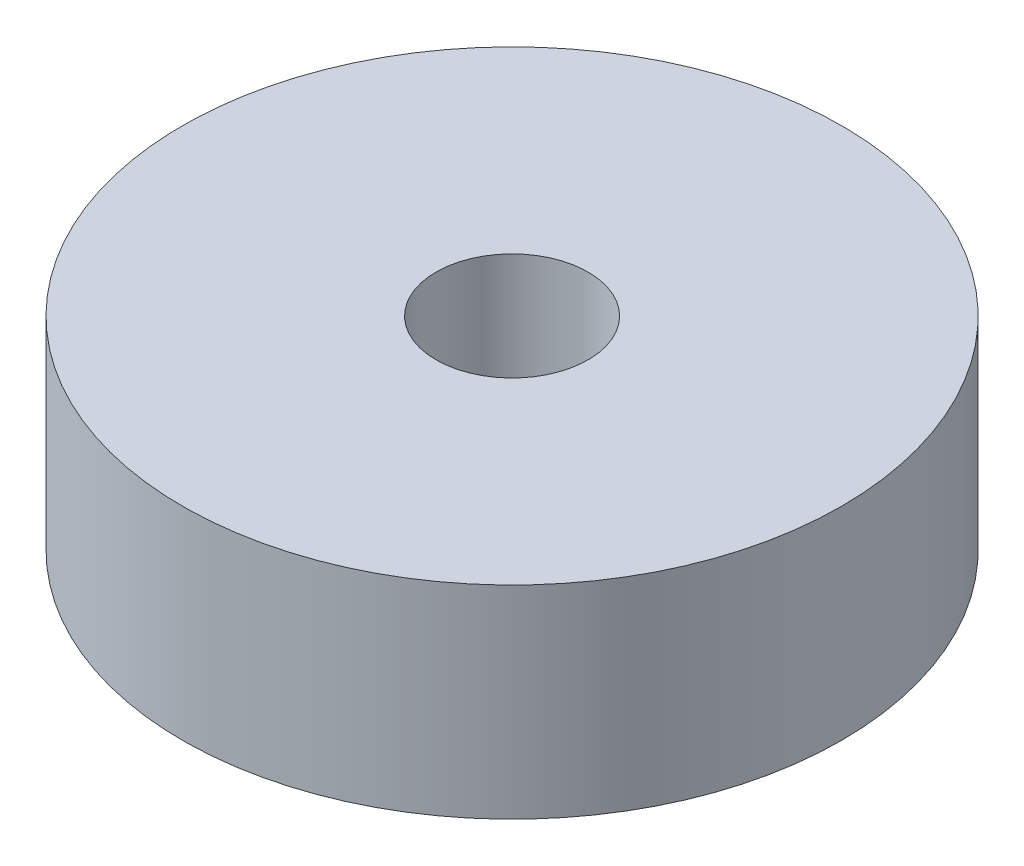
ISO-10303-21;
HEADER;
FILE_DESCRIPTION(('STEP AP214'),'2;1');
FILE_NAME('part.step','',(''),(''),'','','');
FILE_SCHEMA(('AUTOMOTIVE_DESIGN { 1 0 10303 214 1 1 1 1 }'));
ENDSEC;
DATA;
#1=APPLICATION_CONTEXT('core data for automotive mechanical design processes');
#2=APPLICATION_PROTOCOL_DEFINITION('international standard','automotive_design',2000,#1);
#3=PRODUCT_CONTEXT('',#1,'mechanical');
#4=PRODUCT('Part','Part','',(#3));
#5=PRODUCT_RELATED_PRODUCT_CATEGORY('part','',(#4));
#6=PRODUCT_DEFINITION_FORMATION('','',#4);
#7=PRODUCT_DEFINITION_CONTEXT('part definition',#1,'design');
#8=PRODUCT_DEFINITION('design','',#6,#7);
#9=PRODUCT_DEFINITION_SHAPE('','',#8);
#10=(LENGTH_UNIT() NAMED_UNIT(*) SI_UNIT(.MILLI.,.METRE.));
#11=(NAMED_UNIT(*) PLANE_ANGLE_UNIT() SI_UNIT($,.RADIAN.));
#12=(NAMED_UNIT(*) SI_UNIT($,.STERADIAN.) SOLID_ANGLE_UNIT());
#13=UNCERTAINTY_MEASURE_WITH_UNIT(LENGTH_MEASURE(1.E-05),#10,'distance_accuracy_value','');
#14=(GEOMETRIC_REPRESENTATION_CONTEXT(3) GLOBAL_UNCERTAINTY_ASSIGNED_CONTEXT((#13)) GLOBAL_UNIT_ASSIGNED_CONTEXT((#10,
#11,#12)) REPRESENTATION_CONTEXT('',''));
#15=CARTESIAN_POINT('',(0.,0.,0.));
#16=DIRECTION('',(0.,0.,1.));
#17=DIRECTION('',(1.,0.,0.));
#18=AXIS2_PLACEMENT_3D('',#15,#16,#17);
#19=CARTESIAN_POINT('',(0.,4.,0.));
#20=DIRECTION('',(0.,1.,0.));
#21=DIRECTION('',(0.,0.,1.));
#22=AXIS2_PLACEMENT_3D('',#19,#20,#21);
#23=PLANE('',#22);
#24=CARTESIAN_POINT('',(0.,4.,0.));
#25=DIRECTION('',(0.,1.,0.));
#26=DIRECTION('',(1.,0.,0.));
#27=AXIS2_PLACEMENT_3D('',#24,#25,#26);
#28=CIRCLE('',#27,6.5);
#29=CARTESIAN_POINT('',(6.5,4.,0.));
#30=VERTEX_POINT('',#29);
#31=EDGE_CURVE('E11',#30,#30,#28,.T.);
#32=ORIENTED_EDGE('',*,*,#31,.T.);
#33=EDGE_LOOP('',(#32));
#34=FACE_BOUND('',#33,.T.);
#35=CARTESIAN_POINT('',(0.,4.,0.));
#36=DIRECTION('',(0.,1.,0.));
#37=DIRECTION('',(0.,0.,1.));
#38=AXIS2_PLACEMENT_3D('',#35,#36,#37);
#39=CIRCLE('',#38,1.5);
#40=CARTESIAN_POINT('',(0.,4.,1.5));
#41=VERTEX_POINT('',#40);
#42=EDGE_CURVE('E48',#41,#41,#39,.T.);
#43=ORIENTED_EDGE('',*,*,#42,.F.);
#44=EDGE_LOOP('',(#43));
#45=FACE_BOUND('',#44,.T.);
#46=ADVANCED_FACE('F37',(#34,#45),#23,.T.);
#47=CARTESIAN_POINT('',(0.,0.,0.));
#48=DIRECTION('',(0.,1.,0.));
#49=DIRECTION('',(0.,0.,1.));
#50=AXIS2_PLACEMENT_3D('',#47,#48,#49);
#51=PLANE('',#50);
#52=CARTESIAN_POINT('',(0.,0.,0.));
#53=DIRECTION('',(0.,1.,0.));
#54=DIRECTION('',(1.,0.,0.));
#55=AXIS2_PLACEMENT_3D('',#52,#53,#54);
#56=CIRCLE('',#55,6.5);
#57=CARTESIAN_POINT('',(6.5,0.,0.));
#58=VERTEX_POINT('',#57);
#59=EDGE_CURVE('E41',#58,#58,#56,.T.);
#60=ORIENTED_EDGE('',*,*,#59,.F.);
#61=EDGE_LOOP('',(#60));
#62=FACE_BOUND('',#61,.T.);
#63=CARTESIAN_POINT('',(0.,0.,0.));
#64=DIRECTION('',(0.,1.,0.));
#65=DIRECTION('',(0.,0.,1.));
#66=AXIS2_PLACEMENT_3D('',#63,#64,#65);
#67=CIRCLE('',#66,1.5);
#68=CARTESIAN_POINT('',(0.,0.,1.5));
#69=VERTEX_POINT('',#68);
#70=EDGE_CURVE('E50',#69,#69,#67,.T.);
#71=ORIENTED_EDGE('',*,*,#70,.T.);
#72=EDGE_LOOP('',(#71));
#73=FACE_BOUND('',#72,.T.);
#74=ADVANCED_FACE('F60',(#62,#73),#51,.F.);
#75=CARTESIAN_POINT('',(0.,4.,0.));
#76=DIRECTION('',(0.,-1.,0.));
#77=DIRECTION('',(0.,0.,-1.));
#78=AXIS2_PLACEMENT_3D('',#75,#76,#77);
#79=CYLINDRICAL_SURFACE('',#78,6.5);
#80=ORIENTED_EDGE('',*,*,#31,.F.);
#81=EDGE_LOOP('',(#80));
#82=FACE_BOUND('',#81,.T.);
#83=ORIENTED_EDGE('',*,*,#59,.T.);
#84=EDGE_LOOP('',(#83));
#85=FACE_BOUND('',#84,.T.);
#86=ADVANCED_FACE('F39',(#82,#85),#79,.T.);
#87=CARTESIAN_POINT('',(0.,4.,0.));
#88=DIRECTION('',(0.,-1.,0.));
#89=DIRECTION('',(0.,0.,-1.));
#90=AXIS2_PLACEMENT_3D('',#87,#88,#89);
#91=CYLINDRICAL_SURFACE('',#90,1.5);
#92=ORIENTED_EDGE('',*,*,#42,.T.);
#93=EDGE_LOOP('',(#92));
#94=FACE_BOUND('',#93,.T.);
#95=ORIENTED_EDGE('',*,*,#70,.F.);
#96=EDGE_LOOP('',(#95));
#97=FACE_BOUND('',#96,.T.);
#98=ADVANCED_FACE('F56',(#94,#97),#91,.F.);
#99=CLOSED_SHELL('',(#46,#74,#86,#98));
#100=MANIFOLD_SOLID_BREP('B2',#99);
#101=ADVANCED_BREP_SHAPE_REPRESENTATION('',(#18,#100),#14);
#102=SHAPE_DEFINITION_REPRESENTATION(#9,#101);
ENDSEC;
END-ISO-10303-21;
